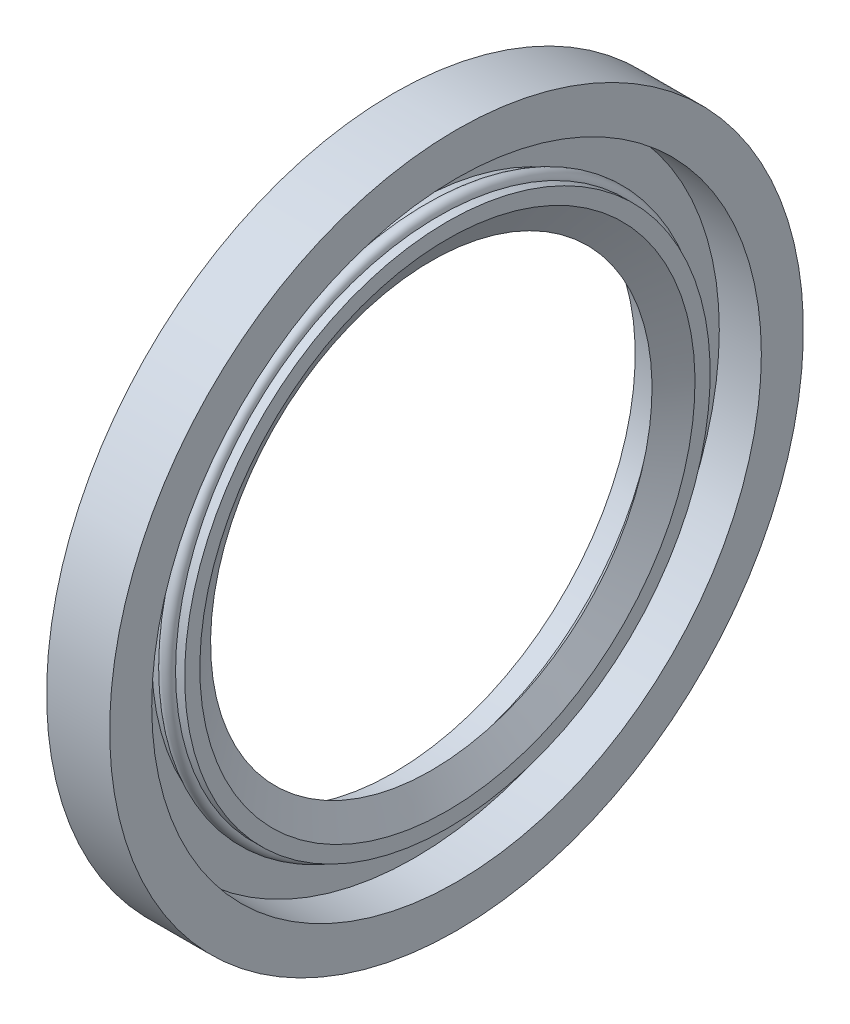
ISO-10303-21;
HEADER;
FILE_DESCRIPTION(('STEP AP214'),'2;1');
FILE_NAME('part.step','',(''),(''),'','','');
FILE_SCHEMA(('AUTOMOTIVE_DESIGN { 1 0 10303 214 1 1 1 1 }'));
ENDSEC;
DATA;
#1=APPLICATION_CONTEXT('core data for automotive mechanical design processes');
#2=APPLICATION_PROTOCOL_DEFINITION('international standard','automotive_design',2000,#1);
#3=PRODUCT_CONTEXT('',#1,'mechanical');
#4=PRODUCT('Part','Part','',(#3));
#5=PRODUCT_RELATED_PRODUCT_CATEGORY('part','',(#4));
#6=PRODUCT_DEFINITION_FORMATION('','',#4);
#7=PRODUCT_DEFINITION_CONTEXT('part definition',#1,'design');
#8=PRODUCT_DEFINITION('design','',#6,#7);
#9=PRODUCT_DEFINITION_SHAPE('','',#8);
#10=(LENGTH_UNIT() NAMED_UNIT(*) SI_UNIT(.MILLI.,.METRE.));
#11=(NAMED_UNIT(*) PLANE_ANGLE_UNIT() SI_UNIT($,.RADIAN.));
#12=(NAMED_UNIT(*) SI_UNIT($,.STERADIAN.) SOLID_ANGLE_UNIT());
#13=UNCERTAINTY_MEASURE_WITH_UNIT(LENGTH_MEASURE(1.E-05),#10,'distance_accuracy_value','');
#14=(GEOMETRIC_REPRESENTATION_CONTEXT(3) GLOBAL_UNCERTAINTY_ASSIGNED_CONTEXT((#13)) GLOBAL_UNIT_ASSIGNED_CONTEXT((#10,
#11,#12)) REPRESENTATION_CONTEXT('',''));
#15=CARTESIAN_POINT('',(0.,0.,0.));
#16=DIRECTION('',(0.,0.,1.));
#17=DIRECTION('',(1.,0.,0.));
#18=AXIS2_PLACEMENT_3D('',#15,#16,#17);
#19=CARTESIAN_POINT('',(0.,55.,0.));
#20=DIRECTION('',(-1.,0.,0.));
#21=DIRECTION('',(0.,0.,1.));
#22=AXIS2_PLACEMENT_3D('',#19,#20,#21);
#23=PLANE('',#22);
#24=CARTESIAN_POINT('',(0.,0.,0.));
#25=DIRECTION('',(1.,0.,0.));
#26=DIRECTION('',(0.,0.,-1.));
#27=AXIS2_PLACEMENT_3D('',#24,#25,#26);
#28=CIRCLE('',#27,38.333333333333);
#29=CARTESIAN_POINT('',(0.,-38.333333333333,0.));
#30=VERTEX_POINT('',#29);
#31=EDGE_CURVE('E11',#30,#30,#28,.T.);
#32=ORIENTED_EDGE('',*,*,#31,.T.);
#33=EDGE_LOOP('',(#32));
#34=FACE_BOUND('',#33,.T.);
#35=CARTESIAN_POINT('',(0.,0.,0.));
#36=DIRECTION('',(1.,0.,0.));
#37=DIRECTION('',(0.,0.,-1.));
#38=AXIS2_PLACEMENT_3D('',#35,#36,#37);
#39=CIRCLE('',#38,55.);
#40=CARTESIAN_POINT('',(0.,-55.,0.));
#41=VERTEX_POINT('',#40);
#42=EDGE_CURVE('E84',#41,#41,#39,.T.);
#43=ORIENTED_EDGE('',*,*,#42,.F.);
#44=EDGE_LOOP('',(#43));
#45=FACE_BOUND('',#44,.T.);
#46=ADVANCED_FACE('F17',(#34,#45),#23,.T.);
#47=CARTESIAN_POINT('',(1.66666666666665,0.,0.));
#48=DIRECTION('',(1.,0.,0.));
#49=DIRECTION('',(0.,1.,0.));
#50=AXIS2_PLACEMENT_3D('',#47,#48,#49);
#51=CYLINDRICAL_SURFACE('',#50,38.333333333333);
#52=CARTESIAN_POINT('',(3.3333333333333,0.,0.));
#53=DIRECTION('',(1.,0.,0.));
#54=DIRECTION('',(0.,0.,-1.));
#55=AXIS2_PLACEMENT_3D('',#52,#53,#54);
#56=CIRCLE('',#55,38.333333333333);
#57=CARTESIAN_POINT('',(3.3333333333333,-38.333333333333,0.));
#58=VERTEX_POINT('',#57);
#59=EDGE_CURVE('E136',#58,#58,#56,.T.);
#60=ORIENTED_EDGE('',*,*,#59,.T.);
#61=DIRECTION('',(-1.,0.,0.));
#62=VECTOR('',#61,1.);
#63=CARTESIAN_POINT('',(1.66666666666665,-38.333333333333,0.));
#64=LINE('',#63,#62);
#65=EDGE_CURVE('E28',#58,#30,#64,.T.);
#66=ORIENTED_EDGE('',*,*,#65,.T.);
#67=ORIENTED_EDGE('',*,*,#31,.F.);
#68=ORIENTED_EDGE('',*,*,#65,.F.);
#69=EDGE_LOOP('',(#60,#66,#67,#68));
#70=FACE_BOUND('',#69,.T.);
#71=ADVANCED_FACE('F197',(#70),#51,.F.);
#72=CARTESIAN_POINT('',(4.66666666666665,0.,0.));
#73=DIRECTION('',(-1.,0.,0.));
#74=DIRECTION('',(0.,1.,0.));
#75=AXIS2_PLACEMENT_3D('',#72,#73,#74);
#76=CONICAL_SURFACE('',#75,36.6666666666665,0.896055384571289);
#77=CARTESIAN_POINT('',(6.,0.,0.));
#78=DIRECTION('',(1.,0.,0.));
#79=DIRECTION('',(0.,0.,-1.));
#80=AXIS2_PLACEMENT_3D('',#77,#78,#79);
#81=CIRCLE('',#80,35.);
#82=CARTESIAN_POINT('',(6.,-35.,0.));
#83=VERTEX_POINT('',#82);
#84=EDGE_CURVE('E113',#83,#83,#81,.T.);
#85=ORIENTED_EDGE('',*,*,#84,.T.);
#86=DIRECTION('',(-0.624695047554467,-0.780868809442996,0.));
#87=VECTOR('',#86,1.);
#88=CARTESIAN_POINT('',(4.66666666666665,-36.6666666666665,0.));
#89=LINE('',#88,#87);
#90=EDGE_CURVE('E123',#83,#58,#89,.T.);
#91=ORIENTED_EDGE('',*,*,#90,.T.);
#92=ORIENTED_EDGE('',*,*,#59,.F.);
#93=ORIENTED_EDGE('',*,*,#90,.F.);
#94=EDGE_LOOP('',(#85,#91,#92,#93));
#95=FACE_BOUND('',#94,.T.);
#96=ADVANCED_FACE('F203',(#95),#76,.F.);
#97=CARTESIAN_POINT('',(7.27777775,0.,0.));
#98=DIRECTION('',(1.,0.,0.));
#99=DIRECTION('',(0.,1.,0.));
#100=AXIS2_PLACEMENT_3D('',#97,#98,#99);
#101=CONICAL_SURFACE('',#100,37.1296295833335,1.03037682652435);
#102=CARTESIAN_POINT('',(8.5555555,0.,0.));
#103=DIRECTION('',(1.,0.,0.));
#104=DIRECTION('',(0.,0.,-1.));
#105=AXIS2_PLACEMENT_3D('',#102,#103,#104);
#106=CIRCLE('',#105,39.259259166667);
#107=CARTESIAN_POINT('',(8.5555555,-39.259259166667,0.));
#108=VERTEX_POINT('',#107);
#109=EDGE_CURVE('E114',#108,#108,#106,.T.);
#110=ORIENTED_EDGE('',*,*,#109,.T.);
#111=DIRECTION('',(-0.514495755427497,0.857492925712562,0.));
#112=VECTOR('',#111,1.);
#113=CARTESIAN_POINT('',(7.27777775,-37.1296295833335,0.));
#114=LINE('',#113,#112);
#115=EDGE_CURVE('E110',#108,#83,#114,.T.);
#116=ORIENTED_EDGE('',*,*,#115,.T.);
#117=ORIENTED_EDGE('',*,*,#84,.F.);
#118=ORIENTED_EDGE('',*,*,#115,.F.);
#119=EDGE_LOOP('',(#110,#116,#117,#118));
#120=FACE_BOUND('',#119,.T.);
#121=ADVANCED_FACE('F288',(#120),#101,.F.);
#122=CARTESIAN_POINT('',(8.5555555,39.259259166667,0.));
#123=DIRECTION('',(1.,0.,0.));
#124=DIRECTION('',(0.,1.,0.));
#125=AXIS2_PLACEMENT_3D('',#122,#123,#124);
#126=PLANE('',#125);
#127=ORIENTED_EDGE('',*,*,#109,.F.);
#128=EDGE_LOOP('',(#127));
#129=FACE_BOUND('',#128,.T.);
#130=CARTESIAN_POINT('',(8.5555555,0.,0.));
#131=DIRECTION('',(1.,0.,0.));
#132=DIRECTION('',(0.,0.,-1.));
#133=AXIS2_PLACEMENT_3D('',#130,#131,#132);
#134=CIRCLE('',#133,41.666666666667);
#135=CARTESIAN_POINT('',(8.5555555,-41.666666666667,0.));
#136=VERTEX_POINT('',#135);
#137=EDGE_CURVE('E108',#136,#136,#134,.T.);
#138=ORIENTED_EDGE('',*,*,#137,.T.);
#139=EDGE_LOOP('',(#138));
#140=FACE_BOUND('',#139,.T.);
#141=ADVANCED_FACE('F292',(#129,#140),#126,.T.);
#142=CARTESIAN_POINT('',(7.83333325,0.,0.));
#143=DIRECTION('',(1.,0.,0.));
#144=DIRECTION('',(0.,1.,0.));
#145=AXIS2_PLACEMENT_3D('',#142,#143,#144);
#146=CYLINDRICAL_SURFACE('',#145,41.666666666667);
#147=ORIENTED_EDGE('',*,*,#137,.F.);
#148=DIRECTION('',(-1.,0.,0.));
#149=VECTOR('',#148,1.);
#150=CARTESIAN_POINT('',(7.83333325,-41.666666666667,0.));
#151=LINE('',#150,#149);
#152=CARTESIAN_POINT('',(7.111111,-41.666666666667,0.));
#153=VERTEX_POINT('',#152);
#154=EDGE_CURVE('E125',#136,#153,#151,.T.);
#155=ORIENTED_EDGE('',*,*,#154,.T.);
#156=CARTESIAN_POINT('',(7.111111,0.,0.));
#157=DIRECTION('',(1.,0.,0.));
#158=DIRECTION('',(0.,0.,-1.));
#159=AXIS2_PLACEMENT_3D('',#156,#157,#158);
#160=CIRCLE('',#159,41.666666666667);
#161=CARTESIAN_POINT('',(7.111111,0.,41.666666666667));
#162=VERTEX_POINT('',#161);
#163=EDGE_CURVE('E146',#153,#162,#160,.T.);
#164=ORIENTED_EDGE('',*,*,#163,.T.);
#165=CARTESIAN_POINT('',(7.111111,0.,0.));
#166=DIRECTION('',(1.,0.,0.));
#167=DIRECTION('',(0.,0.,-1.));
#168=AXIS2_PLACEMENT_3D('',#165,#166,#167);
#169=CIRCLE('',#168,41.666666666667);
#170=EDGE_CURVE('E109',#162,#153,#169,.T.);
#171=ORIENTED_EDGE('',*,*,#170,.T.);
#172=ORIENTED_EDGE('',*,*,#154,.F.);
#173=EDGE_LOOP('',(#147,#155,#164,#171,#172));
#174=FACE_BOUND('',#173,.T.);
#175=ADVANCED_FACE('F280',(#174),#146,.T.);
#176=CARTESIAN_POINT('',(6.,0.,0.));
#177=DIRECTION('',(1.,0.,0.));
#178=DIRECTION('',(0.,0.,-1.));
#179=AXIS2_PLACEMENT_3D('',#176,#177,#178);
#180=TOROIDAL_SURFACE('',#179,41.666666666667,1.111111);
#181=ORIENTED_EDGE('',*,*,#163,.F.);
#182=ORIENTED_EDGE('',*,*,#170,.F.);
#183=CARTESIAN_POINT('',(6.,0.,41.666666666667));
#184=DIRECTION('',(0.,-1.,0.));
#185=DIRECTION('',(0.,0.,1.));
#186=AXIS2_PLACEMENT_3D('',#183,#184,#185);
#187=CIRCLE('',#186,1.111111);
#188=CARTESIAN_POINT('',(4.888889,0.,41.666666666667));
#189=VERTEX_POINT('',#188);
#190=EDGE_CURVE('E106',#162,#189,#187,.T.);
#191=ORIENTED_EDGE('',*,*,#190,.T.);
#192=CARTESIAN_POINT('',(4.888889,0.,0.));
#193=DIRECTION('',(1.,0.,0.));
#194=DIRECTION('',(0.,0.,-1.));
#195=AXIS2_PLACEMENT_3D('',#192,#193,#194);
#196=CIRCLE('',#195,41.666666666667);
#197=CARTESIAN_POINT('',(4.888889,-41.666666666667,0.));
#198=VERTEX_POINT('',#197);
#199=EDGE_CURVE('E159',#189,#198,#196,.T.);
#200=ORIENTED_EDGE('',*,*,#199,.T.);
#201=CARTESIAN_POINT('',(4.888889,0.,0.));
#202=DIRECTION('',(1.,0.,0.));
#203=DIRECTION('',(0.,0.,-1.));
#204=AXIS2_PLACEMENT_3D('',#201,#202,#203);
#205=CIRCLE('',#204,41.666666666667);
#206=EDGE_CURVE('E147',#198,#189,#205,.T.);
#207=ORIENTED_EDGE('',*,*,#206,.T.);
#208=ORIENTED_EDGE('',*,*,#190,.F.);
#209=EDGE_LOOP('',(#181,#182,#191,#200,#207,#208));
#210=FACE_BOUND('',#209,.T.);
#211=ADVANCED_FACE('F214',(#210),#180,.T.);
#212=CARTESIAN_POINT('',(4.11111116666665,0.,0.));
#213=DIRECTION('',(1.,0.,0.));
#214=DIRECTION('',(0.,1.,0.));
#215=AXIS2_PLACEMENT_3D('',#212,#213,#214);
#216=CYLINDRICAL_SURFACE('',#215,41.666666666667);
#217=ORIENTED_EDGE('',*,*,#206,.F.);
#218=DIRECTION('',(-1.,0.,0.));
#219=VECTOR('',#218,1.);
#220=CARTESIAN_POINT('',(4.11111116666665,-41.666666666667,0.));
#221=LINE('',#220,#219);
#222=CARTESIAN_POINT('',(3.3333333333333,-41.666666666667,0.));
#223=VERTEX_POINT('',#222);
#224=EDGE_CURVE('E21',#198,#223,#221,.T.);
#225=ORIENTED_EDGE('',*,*,#224,.T.);
#226=CARTESIAN_POINT('',(3.3333333333333,0.,0.));
#227=DIRECTION('',(1.,0.,0.));
#228=DIRECTION('',(0.,0.,-1.));
#229=AXIS2_PLACEMENT_3D('',#226,#227,#228);
#230=CIRCLE('',#229,41.666666666667);
#231=EDGE_CURVE('E150',#223,#223,#230,.T.);
#232=ORIENTED_EDGE('',*,*,#231,.T.);
#233=ORIENTED_EDGE('',*,*,#224,.F.);
#234=ORIENTED_EDGE('',*,*,#199,.F.);
#235=EDGE_LOOP('',(#217,#225,#232,#233,#234));
#236=FACE_BOUND('',#235,.T.);
#237=ADVANCED_FACE('F207',(#236),#216,.T.);
#238=CARTESIAN_POINT('',(3.3333333333333,41.666666666667,0.));
#239=DIRECTION('',(1.,0.,0.));
#240=DIRECTION('',(0.,1.,0.));
#241=AXIS2_PLACEMENT_3D('',#238,#239,#240);
#242=PLANE('',#241);
#243=ORIENTED_EDGE('',*,*,#231,.F.);
#244=EDGE_LOOP('',(#243));
#245=FACE_BOUND('',#244,.T.);
#246=CARTESIAN_POINT('',(3.3333333333333,0.,0.));
#247=DIRECTION('',(1.,0.,0.));
#248=DIRECTION('',(0.,0.,-1.));
#249=AXIS2_PLACEMENT_3D('',#246,#247,#248);
#250=CIRCLE('',#249,48.333333333333);
#251=CARTESIAN_POINT('',(3.3333333333333,-48.333333333333,0.));
#252=VERTEX_POINT('',#251);
#253=EDGE_CURVE('E104',#252,#252,#250,.T.);
#254=ORIENTED_EDGE('',*,*,#253,.T.);
#255=EDGE_LOOP('',(#254));
#256=FACE_BOUND('',#255,.T.);
#257=ADVANCED_FACE('F191',(#245,#256),#242,.T.);
#258=CARTESIAN_POINT('',(6.66666666666665,0.,0.));
#259=DIRECTION('',(1.,0.,0.));
#260=DIRECTION('',(0.,1.,0.));
#261=AXIS2_PLACEMENT_3D('',#258,#259,#260);
#262=CYLINDRICAL_SURFACE('',#261,48.333333333333);
#263=CARTESIAN_POINT('',(10.,0.,0.));
#264=DIRECTION('',(1.,0.,0.));
#265=DIRECTION('',(0.,0.,-1.));
#266=AXIS2_PLACEMENT_3D('',#263,#264,#265);
#267=CIRCLE('',#266,48.333333333333);
#268=CARTESIAN_POINT('',(10.,-48.333333333333,0.));
#269=VERTEX_POINT('',#268);
#270=EDGE_CURVE('E90',#269,#269,#267,.T.);
#271=ORIENTED_EDGE('',*,*,#270,.T.);
#272=DIRECTION('',(-1.,0.,0.));
#273=VECTOR('',#272,1.);
#274=CARTESIAN_POINT('',(6.66666666666665,-48.333333333333,0.));
#275=LINE('',#274,#273);
#276=EDGE_CURVE('E98',#269,#252,#275,.T.);
#277=ORIENTED_EDGE('',*,*,#276,.T.);
#278=ORIENTED_EDGE('',*,*,#253,.F.);
#279=ORIENTED_EDGE('',*,*,#276,.F.);
#280=EDGE_LOOP('',(#271,#277,#278,#279));
#281=FACE_BOUND('',#280,.T.);
#282=ADVANCED_FACE('F183',(#281),#262,.F.);
#283=CARTESIAN_POINT('',(10.,48.333333333333,0.));
#284=DIRECTION('',(1.,0.,0.));
#285=DIRECTION('',(0.,1.,0.));
#286=AXIS2_PLACEMENT_3D('',#283,#284,#285);
#287=PLANE('',#286);
#288=ORIENTED_EDGE('',*,*,#270,.F.);
#289=EDGE_LOOP('',(#288));
#290=FACE_BOUND('',#289,.T.);
#291=CARTESIAN_POINT('',(10.,0.,0.));
#292=DIRECTION('',(1.,0.,0.));
#293=DIRECTION('',(0.,0.,-1.));
#294=AXIS2_PLACEMENT_3D('',#291,#292,#293);
#295=CIRCLE('',#294,55.);
#296=CARTESIAN_POINT('',(10.,-55.,0.));
#297=VERTEX_POINT('',#296);
#298=EDGE_CURVE('E100',#297,#297,#295,.T.);
#299=ORIENTED_EDGE('',*,*,#298,.T.);
#300=EDGE_LOOP('',(#299));
#301=FACE_BOUND('',#300,.T.);
#302=ADVANCED_FACE('F181',(#290,#301),#287,.T.);
#303=CARTESIAN_POINT('',(5.,0.,0.));
#304=DIRECTION('',(1.,0.,0.));
#305=DIRECTION('',(0.,1.,0.));
#306=AXIS2_PLACEMENT_3D('',#303,#304,#305);
#307=CYLINDRICAL_SURFACE('',#306,55.);
#308=ORIENTED_EDGE('',*,*,#298,.F.);
#309=DIRECTION('',(-1.,0.,0.));
#310=VECTOR('',#309,1.);
#311=CARTESIAN_POINT('',(5.,-55.,0.));
#312=LINE('',#311,#310);
#313=EDGE_CURVE('E86',#297,#41,#312,.T.);
#314=ORIENTED_EDGE('',*,*,#313,.T.);
#315=ORIENTED_EDGE('',*,*,#42,.T.);
#316=ORIENTED_EDGE('',*,*,#313,.F.);
#317=EDGE_LOOP('',(#308,#314,#315,#316));
#318=FACE_BOUND('',#317,.T.);
#319=ADVANCED_FACE('F19',(#318),#307,.T.);
#320=CLOSED_SHELL('',(#46,#71,#96,#121,#141,#175,#211,#237,#257,#282,#302,#319));
#321=MANIFOLD_SOLID_BREP('B1',#320);
#322=ADVANCED_BREP_SHAPE_REPRESENTATION('',(#18,#321),#14);
#323=SHAPE_DEFINITION_REPRESENTATION(#9,#322);
ENDSEC;
END-ISO-10303-21;
